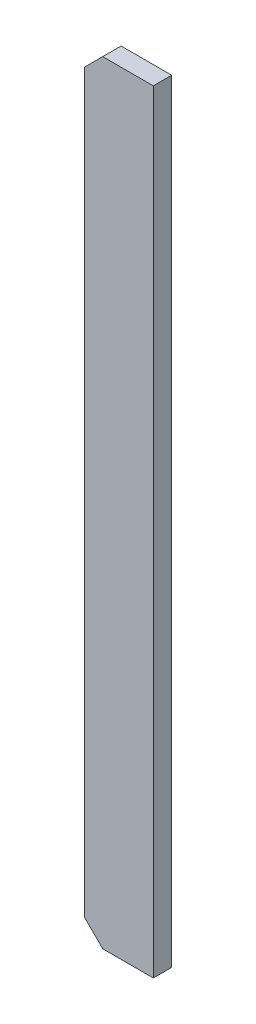
ISO-10303-21;
HEADER;
FILE_DESCRIPTION(('STEP AP214'),'2;1');
FILE_NAME('part.step','',(''),(''),'','','');
FILE_SCHEMA(('AUTOMOTIVE_DESIGN { 1 0 10303 214 1 1 1 1 }'));
ENDSEC;
DATA;
#1=APPLICATION_CONTEXT('core data for automotive mechanical design processes');
#2=APPLICATION_PROTOCOL_DEFINITION('international standard','automotive_design',2000,#1);
#3=PRODUCT_CONTEXT('',#1,'mechanical');
#4=PRODUCT('Part','Part','',(#3));
#5=PRODUCT_RELATED_PRODUCT_CATEGORY('part','',(#4));
#6=PRODUCT_DEFINITION_FORMATION('','',#4);
#7=PRODUCT_DEFINITION_CONTEXT('part definition',#1,'design');
#8=PRODUCT_DEFINITION('design','',#6,#7);
#9=PRODUCT_DEFINITION_SHAPE('','',#8);
#10=(LENGTH_UNIT() NAMED_UNIT(*) SI_UNIT(.MILLI.,.METRE.));
#11=(NAMED_UNIT(*) PLANE_ANGLE_UNIT() SI_UNIT($,.RADIAN.));
#12=(NAMED_UNIT(*) SI_UNIT($,.STERADIAN.) SOLID_ANGLE_UNIT());
#13=UNCERTAINTY_MEASURE_WITH_UNIT(LENGTH_MEASURE(1.E-05),#10,'distance_accuracy_value','');
#14=(GEOMETRIC_REPRESENTATION_CONTEXT(3) GLOBAL_UNCERTAINTY_ASSIGNED_CONTEXT((#13)) GLOBAL_UNIT_ASSIGNED_CONTEXT((#10,
#11,#12)) REPRESENTATION_CONTEXT('',''));
#15=CARTESIAN_POINT('',(0.,0.,0.));
#16=DIRECTION('',(0.,0.,1.));
#17=DIRECTION('',(1.,0.,0.));
#18=AXIS2_PLACEMENT_3D('',#15,#16,#17);
#19=CARTESIAN_POINT('',(-50.8,0.,12.7));
#20=DIRECTION('',(1.,0.,0.));
#21=DIRECTION('',(0.,0.,-1.));
#22=AXIS2_PLACEMENT_3D('',#19,#20,#21);
#23=PLANE('',#22);
#24=DIRECTION('',(0.,-1.,0.));
#25=VECTOR('',#24,1.);
#26=CARTESIAN_POINT('',(-50.8,0.,12.7));
#27=LINE('',#26,#25);
#28=CARTESIAN_POINT('',(-50.8,520.7,12.7));
#29=VERTEX_POINT('',#28);
#30=CARTESIAN_POINT('',(-50.8,12.7,12.7));
#31=VERTEX_POINT('',#30);
#32=EDGE_CURVE('E102',#29,#31,#27,.T.);
#33=ORIENTED_EDGE('',*,*,#32,.F.);
#34=DIRECTION('',(0.,0.,-1.));
#35=VECTOR('',#34,1.);
#36=CARTESIAN_POINT('',(-50.8,520.7,12.7));
#37=LINE('',#36,#35);
#38=CARTESIAN_POINT('',(-50.8,520.7,0.));
#39=VERTEX_POINT('',#38);
#40=EDGE_CURVE('E131',#29,#39,#37,.T.);
#41=ORIENTED_EDGE('',*,*,#40,.T.);
#42=DIRECTION('',(0.,-1.,0.));
#43=VECTOR('',#42,1.);
#44=CARTESIAN_POINT('',(-50.8,0.,0.));
#45=LINE('',#44,#43);
#46=CARTESIAN_POINT('',(-50.8,12.7,0.));
#47=VERTEX_POINT('',#46);
#48=EDGE_CURVE('E121',#39,#47,#45,.T.);
#49=ORIENTED_EDGE('',*,*,#48,.T.);
#50=DIRECTION('',(0.,0.,1.));
#51=VECTOR('',#50,1.);
#52=CARTESIAN_POINT('',(-50.8,12.7,12.7));
#53=LINE('',#52,#51);
#54=EDGE_CURVE('E111',#47,#31,#53,.T.);
#55=ORIENTED_EDGE('',*,*,#54,.T.);
#56=EDGE_LOOP('',(#33,#41,#49,#55));
#57=FACE_BOUND('',#56,.T.);
#58=ADVANCED_FACE('F40',(#57),#23,.F.);
#59=CARTESIAN_POINT('',(-50.8,0.,12.7));
#60=DIRECTION('',(0.,1.,0.));
#61=DIRECTION('',(0.,0.,1.));
#62=AXIS2_PLACEMENT_3D('',#59,#60,#61);
#63=PLANE('',#62);
#64=DIRECTION('',(1.,0.,0.));
#65=VECTOR('',#64,1.);
#66=CARTESIAN_POINT('',(-50.8,0.,12.7));
#67=LINE('',#66,#65);
#68=CARTESIAN_POINT('',(-38.1000000000001,0.,12.7));
#69=VERTEX_POINT('',#68);
#70=CARTESIAN_POINT('',(-3.175,0.,12.7));
#71=VERTEX_POINT('',#70);
#72=EDGE_CURVE('E94',#69,#71,#67,.T.);
#73=ORIENTED_EDGE('',*,*,#72,.F.);
#74=DIRECTION('',(0.,0.,-1.));
#75=VECTOR('',#74,1.);
#76=CARTESIAN_POINT('',(-38.1000000000001,0.,12.7));
#77=LINE('',#76,#75);
#78=CARTESIAN_POINT('',(-38.1000000000001,0.,0.));
#79=VERTEX_POINT('',#78);
#80=EDGE_CURVE('E11',#69,#79,#77,.T.);
#81=ORIENTED_EDGE('',*,*,#80,.T.);
#82=DIRECTION('',(1.,0.,0.));
#83=VECTOR('',#82,1.);
#84=CARTESIAN_POINT('',(-50.8,0.,0.));
#85=LINE('',#84,#83);
#86=CARTESIAN_POINT('',(-3.175,0.,0.));
#87=VERTEX_POINT('',#86);
#88=EDGE_CURVE('E108',#79,#87,#85,.T.);
#89=ORIENTED_EDGE('',*,*,#88,.T.);
#90=DIRECTION('',(0.,0.,-1.));
#91=VECTOR('',#90,1.);
#92=CARTESIAN_POINT('',(-3.175,0.,12.7));
#93=LINE('',#92,#91);
#94=EDGE_CURVE('E105',#71,#87,#93,.T.);
#95=ORIENTED_EDGE('',*,*,#94,.F.);
#96=EDGE_LOOP('',(#73,#81,#89,#95));
#97=FACE_BOUND('',#96,.T.);
#98=ADVANCED_FACE('F106',(#97),#63,.F.);
#99=CARTESIAN_POINT('',(-3.175,0.,12.7));
#100=DIRECTION('',(-1.,0.,0.));
#101=DIRECTION('',(0.,-1.,0.));
#102=AXIS2_PLACEMENT_3D('',#99,#100,#101);
#103=PLANE('',#102);
#104=DIRECTION('',(0.,1.,0.));
#105=VECTOR('',#104,1.);
#106=CARTESIAN_POINT('',(-3.175,0.,0.));
#107=LINE('',#106,#105);
#108=CARTESIAN_POINT('',(-3.175,533.4,0.));
#109=VERTEX_POINT('',#108);
#110=EDGE_CURVE('E125',#87,#109,#107,.T.);
#111=ORIENTED_EDGE('',*,*,#110,.T.);
#112=DIRECTION('',(0.,0.,-1.));
#113=VECTOR('',#112,1.);
#114=CARTESIAN_POINT('',(-3.175,533.4,12.7));
#115=LINE('',#114,#113);
#116=CARTESIAN_POINT('',(-3.175,533.4,12.7));
#117=VERTEX_POINT('',#116);
#118=EDGE_CURVE('E112',#117,#109,#115,.T.);
#119=ORIENTED_EDGE('',*,*,#118,.F.);
#120=DIRECTION('',(0.,1.,0.));
#121=VECTOR('',#120,1.);
#122=CARTESIAN_POINT('',(-3.175,0.,12.7));
#123=LINE('',#122,#121);
#124=EDGE_CURVE('E98',#71,#117,#123,.T.);
#125=ORIENTED_EDGE('',*,*,#124,.F.);
#126=ORIENTED_EDGE('',*,*,#94,.T.);
#127=EDGE_LOOP('',(#111,#119,#125,#126));
#128=FACE_BOUND('',#127,.T.);
#129=ADVANCED_FACE('F114',(#128),#103,.F.);
#130=CARTESIAN_POINT('',(-50.8,533.4,12.7));
#131=DIRECTION('',(0.,-1.,0.));
#132=DIRECTION('',(0.,0.,-1.));
#133=AXIS2_PLACEMENT_3D('',#130,#131,#132);
#134=PLANE('',#133);
#135=DIRECTION('',(-1.,0.,0.));
#136=VECTOR('',#135,1.);
#137=CARTESIAN_POINT('',(-50.8,533.4,0.));
#138=LINE('',#137,#136);
#139=CARTESIAN_POINT('',(-38.1,533.4,0.));
#140=VERTEX_POINT('',#139);
#141=EDGE_CURVE('E127',#109,#140,#138,.T.);
#142=ORIENTED_EDGE('',*,*,#141,.T.);
#143=DIRECTION('',(0.,0.,1.));
#144=VECTOR('',#143,1.);
#145=CARTESIAN_POINT('',(-38.1,533.4,12.7));
#146=LINE('',#145,#144);
#147=CARTESIAN_POINT('',(-38.1,533.4,12.7));
#148=VERTEX_POINT('',#147);
#149=EDGE_CURVE('E64',#140,#148,#146,.T.);
#150=ORIENTED_EDGE('',*,*,#149,.T.);
#151=DIRECTION('',(-1.,0.,0.));
#152=VECTOR('',#151,1.);
#153=CARTESIAN_POINT('',(-50.8,533.4,12.7));
#154=LINE('',#153,#152);
#155=EDGE_CURVE('E116',#117,#148,#154,.T.);
#156=ORIENTED_EDGE('',*,*,#155,.F.);
#157=ORIENTED_EDGE('',*,*,#118,.T.);
#158=EDGE_LOOP('',(#142,#150,#156,#157));
#159=FACE_BOUND('',#158,.T.);
#160=ADVANCED_FACE('F150',(#159),#134,.F.);
#161=CARTESIAN_POINT('',(0.,0.,12.7));
#162=DIRECTION('',(0.,0.,-1.));
#163=DIRECTION('',(-1.,0.,0.));
#164=AXIS2_PLACEMENT_3D('',#161,#162,#163);
#165=PLANE('',#164);
#166=ORIENTED_EDGE('',*,*,#155,.T.);
#167=DIRECTION('',(0.707106781186544,0.707106781186551,0.));
#168=VECTOR('',#167,1.);
#169=CARTESIAN_POINT('',(-50.8,520.7,12.7));
#170=LINE('',#169,#168);
#171=EDGE_CURVE('E49',#148,#29,#170,.F.);
#172=ORIENTED_EDGE('',*,*,#171,.T.);
#173=ORIENTED_EDGE('',*,*,#32,.T.);
#174=DIRECTION('',(-0.707106781186546,0.707106781186549,0.));
#175=VECTOR('',#174,1.);
#176=CARTESIAN_POINT('',(-38.1000000000001,0.,12.7));
#177=LINE('',#176,#175);
#178=EDGE_CURVE('E56',#31,#69,#177,.F.);
#179=ORIENTED_EDGE('',*,*,#178,.T.);
#180=ORIENTED_EDGE('',*,*,#72,.T.);
#181=ORIENTED_EDGE('',*,*,#124,.T.);
#182=EDGE_LOOP('',(#166,#172,#173,#179,#180,#181));
#183=FACE_BOUND('',#182,.T.);
#184=ADVANCED_FACE('F96',(#183),#165,.F.);
#185=CARTESIAN_POINT('',(0.,0.,0.));
#186=DIRECTION('',(0.,0.,-1.));
#187=DIRECTION('',(-1.,0.,0.));
#188=AXIS2_PLACEMENT_3D('',#185,#186,#187);
#189=PLANE('',#188);
#190=ORIENTED_EDGE('',*,*,#48,.F.);
#191=DIRECTION('',(-0.707106781186544,-0.707106781186551,0.));
#192=VECTOR('',#191,1.);
#193=CARTESIAN_POINT('',(-285.75,285.749999999998,0.));
#194=LINE('',#193,#192);
#195=EDGE_CURVE('E136',#39,#140,#194,.F.);
#196=ORIENTED_EDGE('',*,*,#195,.T.);
#197=ORIENTED_EDGE('',*,*,#141,.F.);
#198=ORIENTED_EDGE('',*,*,#110,.F.);
#199=ORIENTED_EDGE('',*,*,#88,.F.);
#200=DIRECTION('',(0.707106781186546,-0.707106781186549,0.));
#201=VECTOR('',#200,1.);
#202=CARTESIAN_POINT('',(-19.0500000000001,-19.05,0.));
#203=LINE('',#202,#201);
#204=EDGE_CURVE('E134',#79,#47,#203,.F.);
#205=ORIENTED_EDGE('',*,*,#204,.T.);
#206=EDGE_LOOP('',(#190,#196,#197,#198,#199,#205));
#207=FACE_BOUND('',#206,.T.);
#208=ADVANCED_FACE('F149',(#207),#189,.T.);
#209=CARTESIAN_POINT('',(-50.8,520.7,12.7));
#210=DIRECTION('',(0.707106781186551,-0.707106781186544,0.));
#211=DIRECTION('',(0.,0.,-1.));
#212=AXIS2_PLACEMENT_3D('',#209,#210,#211);
#213=PLANE('',#212);
#214=ORIENTED_EDGE('',*,*,#171,.F.);
#215=ORIENTED_EDGE('',*,*,#149,.F.);
#216=ORIENTED_EDGE('',*,*,#195,.F.);
#217=ORIENTED_EDGE('',*,*,#40,.F.);
#218=EDGE_LOOP('',(#214,#215,#216,#217));
#219=FACE_BOUND('',#218,.T.);
#220=ADVANCED_FACE('F146',(#219),#213,.F.);
#221=CARTESIAN_POINT('',(-38.1000000000001,0.,12.7));
#222=DIRECTION('',(0.707106781186549,0.707106781186546,0.));
#223=DIRECTION('',(0.,0.,-1.));
#224=AXIS2_PLACEMENT_3D('',#221,#222,#223);
#225=PLANE('',#224);
#226=ORIENTED_EDGE('',*,*,#178,.F.);
#227=ORIENTED_EDGE('',*,*,#54,.F.);
#228=ORIENTED_EDGE('',*,*,#204,.F.);
#229=ORIENTED_EDGE('',*,*,#80,.F.);
#230=EDGE_LOOP('',(#226,#227,#228,#229));
#231=FACE_BOUND('',#230,.T.);
#232=ADVANCED_FACE('F43',(#231),#225,.F.);
#233=CLOSED_SHELL('',(#58,#98,#129,#160,#184,#208,#220,#232));
#234=MANIFOLD_SOLID_BREP('B2',#233);
#235=ADVANCED_BREP_SHAPE_REPRESENTATION('',(#18,#234),#14);
#236=SHAPE_DEFINITION_REPRESENTATION(#9,#235);
ENDSEC;
END-ISO-10303-21;
